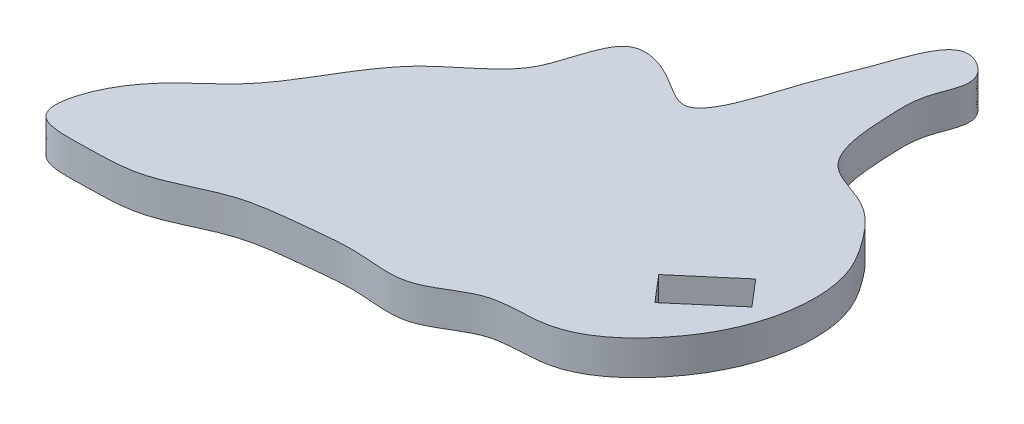
ISO-10303-21;
HEADER;
FILE_DESCRIPTION(('STEP AP214'),'2;1');
FILE_NAME('part.step','',(''),(''),'','','');
FILE_SCHEMA(('AUTOMOTIVE_DESIGN { 1 0 10303 214 1 1 1 1 }'));
ENDSEC;
DATA;
#1=APPLICATION_CONTEXT('core data for automotive mechanical design processes');
#2=APPLICATION_PROTOCOL_DEFINITION('international standard','automotive_design',2000,#1);
#3=PRODUCT_CONTEXT('',#1,'mechanical');
#4=PRODUCT('Part','Part','',(#3));
#5=PRODUCT_RELATED_PRODUCT_CATEGORY('part','',(#4));
#6=PRODUCT_DEFINITION_FORMATION('','',#4);
#7=PRODUCT_DEFINITION_CONTEXT('part definition',#1,'design');
#8=PRODUCT_DEFINITION('design','',#6,#7);
#9=PRODUCT_DEFINITION_SHAPE('','',#8);
#10=(LENGTH_UNIT() NAMED_UNIT(*) SI_UNIT(.MILLI.,.METRE.));
#11=(NAMED_UNIT(*) PLANE_ANGLE_UNIT() SI_UNIT($,.RADIAN.));
#12=(NAMED_UNIT(*) SI_UNIT($,.STERADIAN.) SOLID_ANGLE_UNIT());
#13=UNCERTAINTY_MEASURE_WITH_UNIT(LENGTH_MEASURE(1.E-05),#10,'distance_accuracy_value','');
#14=(GEOMETRIC_REPRESENTATION_CONTEXT(3) GLOBAL_UNCERTAINTY_ASSIGNED_CONTEXT((#13)) GLOBAL_UNIT_ASSIGNED_CONTEXT((#10,
#11,#12)) REPRESENTATION_CONTEXT('',''));
#15=CARTESIAN_POINT('',(0.,0.,0.));
#16=DIRECTION('',(0.,0.,1.));
#17=DIRECTION('',(1.,0.,0.));
#18=AXIS2_PLACEMENT_3D('',#15,#16,#17);
#19=CARTESIAN_POINT('',(-21.4937118023424,5.82080786281612,-44.9247192420672));
#20=CARTESIAN_POINT('',(-20.7495090960647,5.82080786281612,-44.168608810323));
#21=CARTESIAN_POINT('',(-16.8473186747961,5.82080786281612,-44.3347459639853));
#22=CARTESIAN_POINT('',(-11.8877695629677,5.82080786281612,-44.2796755985448));
#23=CARTESIAN_POINT('',(-6.73552611743819,5.82080786281612,-47.5194319644652));
#24=CARTESIAN_POINT('',(-1.08166711714457,5.82080786281612,-48.0062937412049));
#25=CARTESIAN_POINT('',(3.69682183633538,5.82080786281612,-48.6353801714074));
#26=CARTESIAN_POINT('',(8.03740572939902,5.82080786281612,-47.8302652315453));
#27=CARTESIAN_POINT('',(10.9102080211148,5.82080786281612,-49.6162706264283));
#28=CARTESIAN_POINT('',(14.0102946266063,5.82080786281612,-51.4056901517117));
#29=CARTESIAN_POINT('',(19.4607402958262,5.82080786281612,-50.6818274844615));
#30=CARTESIAN_POINT('',(25.239757422972,5.82080786281612,-55.6202912686378));
#31=CARTESIAN_POINT('',(28.7177265277098,5.82080786281612,-62.3854347124005));
#32=CARTESIAN_POINT('',(28.6855888615284,5.82080786281612,-68.7692864827177));
#33=CARTESIAN_POINT('',(26.0314895516941,5.82080786281612,-72.9007599130816));
#34=CARTESIAN_POINT('',(23.4672141211842,5.82080786281612,-75.950078814087));
#35=CARTESIAN_POINT('',(17.6909365791729,5.82080786281612,-76.910599245278));
#36=CARTESIAN_POINT('',(17.4191943347076,5.82080786281612,-82.8836539871628));
#37=CARTESIAN_POINT('',(17.2020761180095,5.82080786281612,-87.2899149088572));
#38=CARTESIAN_POINT('',(19.2987725720755,5.82080786281612,-90.7643500861387));
#39=CARTESIAN_POINT('',(14.7511286503397,5.82080786281612,-93.877589303009));
#40=CARTESIAN_POINT('',(12.910341947581,5.82080786281612,-87.4104051470554));
#41=CARTESIAN_POINT('',(11.023892081615,5.82080786281612,-83.2145764727841));
#42=CARTESIAN_POINT('',(9.92268046217581,5.82080786281612,-79.2079019920944));
#43=CARTESIAN_POINT('',(7.68263356041876,5.82080786281612,-73.9222487003343));
#44=CARTESIAN_POINT('',(3.89404426899399,5.82080786281612,-77.1723871116823));
#45=CARTESIAN_POINT('',(-0.0669296507334657,5.82080786281612,-78.3029078935221));
#46=CARTESIAN_POINT('',(-1.85527923396155,5.82080786281612,-74.7560052124011));
#47=CARTESIAN_POINT('',(-2.68601005073968,5.82080786281612,-70.1252909943946));
#48=CARTESIAN_POINT('',(-10.0665366682588,5.82080786281612,-65.9134066768759));
#49=CARTESIAN_POINT('',(-13.5129033439392,5.82080786281612,-56.5249809585678));
#50=CARTESIAN_POINT('',(-20.5284613360239,5.82080786281612,-52.4258957065665));
#51=CARTESIAN_POINT('',(-22.4764461266043,5.82080786281612,-45.923177952227));
#52=CARTESIAN_POINT('',(-21.4937118023424,5.82080786281612,-44.9247192420672));
#53=B_SPLINE_CURVE_WITH_KNOTS('',3,(#19,#20,#21,#22,#23,#24,#25,#26,#27,#28,#29,#30,#31,#32,#33,
#34,#35,#36,#37,#38,#39,#40,#41,#42,#43,#44,#45,#46,#47,#48,#49,#50,#51,#52),.UNSPECIFIED.,.T.,
.F.,(4,1,1,1,1,1,1,1,1,1,1,1,1,1,1,1,1,1,1,1,1,1,1,1,1,1,1,1,1,1,1,4),(0.,0.0254793810099373,
0.0575432347403678,0.0999556410108082,0.133033817499534,0.163895947509391,0.191559965738004,
0.211929864912126,0.225609616864651,0.258491648264956,0.308276256693139,0.356004359408552,
0.401628858424618,0.418999157725091,0.448323204095496,0.474482631901361,0.516873243511436,
0.538667761491323,0.562806148960943,0.57789910025886,0.616936064484637,0.645339628038696,
0.673283981331484,0.701186966202932,0.724121111102356,0.750378425709185,0.764142361545219,
0.791670233217286,0.838296487185414,0.910523172111104,0.9663539757808,1.),.UNSPECIFIED.);
#54=DIRECTION('',(0.,-1.,0.));
#55=VECTOR('',#54,1.);
#56=SURFACE_OF_LINEAR_EXTRUSION('',#53,#55);
#57=CARTESIAN_POINT('',(-21.4937118023424,5.82080786281612,-44.9247192420672));
#58=VERTEX_POINT('',#57);
#59=EDGE_CURVE('E13',#58,#58,#53,.T.);
#60=ORIENTED_EDGE('',*,*,#59,.F.);
#61=EDGE_LOOP('',(#60));
#62=FACE_BOUND('',#61,.T.);
#63=CARTESIAN_POINT('',(-21.4937118023424,2.64580786281612,-44.9247192420672));
#64=CARTESIAN_POINT('',(-20.7495090960647,2.64580786281612,-44.168608810323));
#65=CARTESIAN_POINT('',(-16.8473186747961,2.64580786281612,-44.3347459639853));
#66=CARTESIAN_POINT('',(-11.8877695629677,2.64580786281612,-44.2796755985448));
#67=CARTESIAN_POINT('',(-6.73552611743819,2.64580786281612,-47.5194319644652));
#68=CARTESIAN_POINT('',(-1.08166711714457,2.64580786281612,-48.0062937412049));
#69=CARTESIAN_POINT('',(3.69682183633538,2.64580786281612,-48.6353801714074));
#70=CARTESIAN_POINT('',(8.03740572939902,2.64580786281612,-47.8302652315453));
#71=CARTESIAN_POINT('',(10.9102080211148,2.64580786281612,-49.6162706264283));
#72=CARTESIAN_POINT('',(14.0102946266063,2.64580786281612,-51.4056901517117));
#73=CARTESIAN_POINT('',(19.4607402958262,2.64580786281612,-50.6818274844615));
#74=CARTESIAN_POINT('',(25.239757422972,2.64580786281612,-55.6202912686378));
#75=CARTESIAN_POINT('',(28.7177265277098,2.64580786281612,-62.3854347124005));
#76=CARTESIAN_POINT('',(28.6855888615284,2.64580786281612,-68.7692864827177));
#77=CARTESIAN_POINT('',(26.0314895516941,2.64580786281612,-72.9007599130816));
#78=CARTESIAN_POINT('',(23.4672141211842,2.64580786281612,-75.950078814087));
#79=CARTESIAN_POINT('',(17.6909365791729,2.64580786281612,-76.910599245278));
#80=CARTESIAN_POINT('',(17.4191943347076,2.64580786281612,-82.8836539871628));
#81=CARTESIAN_POINT('',(17.2020761180095,2.64580786281612,-87.2899149088572));
#82=CARTESIAN_POINT('',(19.2987725720755,2.64580786281612,-90.7643500861387));
#83=CARTESIAN_POINT('',(14.7511286503397,2.64580786281612,-93.877589303009));
#84=CARTESIAN_POINT('',(12.910341947581,2.64580786281612,-87.4104051470554));
#85=CARTESIAN_POINT('',(11.023892081615,2.64580786281612,-83.2145764727841));
#86=CARTESIAN_POINT('',(9.92268046217581,2.64580786281612,-79.2079019920944));
#87=CARTESIAN_POINT('',(7.68263356041876,2.64580786281612,-73.9222487003343));
#88=CARTESIAN_POINT('',(3.89404426899399,2.64580786281612,-77.1723871116823));
#89=CARTESIAN_POINT('',(-0.0669296507334657,2.64580786281612,-78.3029078935221));
#90=CARTESIAN_POINT('',(-1.85527923396155,2.64580786281612,-74.7560052124011));
#91=CARTESIAN_POINT('',(-2.68601005073968,2.64580786281612,-70.1252909943946));
#92=CARTESIAN_POINT('',(-10.0665366682588,2.64580786281612,-65.9134066768759));
#93=CARTESIAN_POINT('',(-13.5129033439392,2.64580786281612,-56.5249809585678));
#94=CARTESIAN_POINT('',(-20.5284613360239,2.64580786281612,-52.4258957065665));
#95=CARTESIAN_POINT('',(-22.4764461266043,2.64580786281612,-45.923177952227));
#96=CARTESIAN_POINT('',(-21.4937118023424,2.64580786281612,-44.9247192420672));
#97=B_SPLINE_CURVE_WITH_KNOTS('',3,(#63,#64,#65,#66,#67,#68,#69,#70,#71,#72,#73,#74,#75,#76,#77,
#78,#79,#80,#81,#82,#83,#84,#85,#86,#87,#88,#89,#90,#91,#92,#93,#94,#95,#96),.UNSPECIFIED.,.T.,
.F.,(4,1,1,1,1,1,1,1,1,1,1,1,1,1,1,1,1,1,1,1,1,1,1,1,1,1,1,1,1,1,1,4),(0.,0.0254793810099373,
0.0575432347403678,0.0999556410108082,0.133033817499534,0.163895947509391,0.191559965738004,
0.211929864912126,0.225609616864651,0.258491648264956,0.308276256693139,0.356004359408552,
0.401628858424618,0.418999157725091,0.448323204095496,0.474482631901361,0.516873243511436,
0.538667761491323,0.562806148960943,0.57789910025886,0.616936064484637,0.645339628038696,
0.673283981331484,0.701186966202932,0.724121111102356,0.750378425709185,0.764142361545219,
0.791670233217286,0.838296487185414,0.910523172111104,0.9663539757808,1.),.UNSPECIFIED.);
#98=CARTESIAN_POINT('',(-21.4937118023424,2.64580786281612,-44.9247192420672));
#99=VERTEX_POINT('',#98);
#100=EDGE_CURVE('E49',#99,#99,#97,.T.);
#101=ORIENTED_EDGE('',*,*,#100,.T.);
#102=EDGE_LOOP('',(#101));
#103=FACE_BOUND('',#102,.T.);
#104=ADVANCED_FACE('F46',(#62,#103),#56,.F.);
#105=CARTESIAN_POINT('',(17.605450660818,5.82080786281612,-80.8926513838277));
#106=DIRECTION('',(0.,1.,0.));
#107=DIRECTION('',(0.,0.,1.));
#108=AXIS2_PLACEMENT_3D('',#105,#106,#107);
#109=PLANE('',#108);
#110=DIRECTION('',(0.760405965600044,0.,-0.649448048330169));
#111=VECTOR('',#110,1.);
#112=CARTESIAN_POINT('',(30.495863149668,5.82080786281612,-65.7999175142455));
#113=LINE('',#112,#111);
#114=CARTESIAN_POINT('',(21.4954162228298,5.82080786281612,-58.1128096334944));
#115=VERTEX_POINT('',#114);
#116=CARTESIAN_POINT('',(26.3239941043901,5.82080786281612,-62.2368047403909));
#117=VERTEX_POINT('',#116);
#118=EDGE_CURVE('E102',#115,#117,#113,.T.);
#119=ORIENTED_EDGE('',*,*,#118,.F.);
#120=DIRECTION('',(-0.649448048330169,0.,-0.760405965600044));
#121=VECTOR('',#120,1.);
#122=CARTESIAN_POINT('',(21.4954162228298,5.82080786281612,-58.1128096334944));
#123=LINE('',#122,#121);
#124=CARTESIAN_POINT('',(19.4334186693815,5.82080786281612,-60.5270985742745));
#125=VERTEX_POINT('',#124);
#126=EDGE_CURVE('E87',#115,#125,#123,.T.);
#127=ORIENTED_EDGE('',*,*,#126,.T.);
#128=DIRECTION('',(0.760405965600044,0.,-0.649448048330169));
#129=VECTOR('',#128,1.);
#130=CARTESIAN_POINT('',(28.4338655962197,5.82080786281612,-68.2142064550257));
#131=LINE('',#130,#129);
#132=CARTESIAN_POINT('',(24.2619965509418,5.82080786281612,-64.6510936811711));
#133=VERTEX_POINT('',#132);
#134=EDGE_CURVE('E97',#125,#133,#131,.T.);
#135=ORIENTED_EDGE('',*,*,#134,.T.);
#136=DIRECTION('',(-0.649448048330169,0.,-0.760405965600044));
#137=VECTOR('',#136,1.);
#138=CARTESIAN_POINT('',(26.3239941043901,5.82080786281612,-62.2368047403909));
#139=LINE('',#138,#137);
#140=EDGE_CURVE('E110',#117,#133,#139,.T.);
#141=ORIENTED_EDGE('',*,*,#140,.F.);
#142=EDGE_LOOP('',(#119,#127,#135,#141));
#143=FACE_BOUND('',#142,.T.);
#144=ORIENTED_EDGE('',*,*,#59,.T.);
#145=EDGE_LOOP('',(#144));
#146=FACE_BOUND('',#145,.T.);
#147=ADVANCED_FACE('F108',(#143,#146),#109,.T.);
#148=CARTESIAN_POINT('',(17.605450660818,2.64580786281612,-80.8926513838277));
#149=DIRECTION('',(0.,1.,0.));
#150=DIRECTION('',(0.,0.,1.));
#151=AXIS2_PLACEMENT_3D('',#148,#149,#150);
#152=PLANE('',#151);
#153=DIRECTION('',(-0.649448048330169,0.,-0.760405965600044));
#154=VECTOR('',#153,1.);
#155=CARTESIAN_POINT('',(21.4954162228298,2.64580786281612,-58.1128096334944));
#156=LINE('',#155,#154);
#157=CARTESIAN_POINT('',(21.4954162228298,2.64580786281612,-58.1128096334944));
#158=VERTEX_POINT('',#157);
#159=CARTESIAN_POINT('',(19.4334186693815,2.64580786281612,-60.5270985742745));
#160=VERTEX_POINT('',#159);
#161=EDGE_CURVE('E70',#158,#160,#156,.T.);
#162=ORIENTED_EDGE('',*,*,#161,.F.);
#163=DIRECTION('',(0.760405965600044,0.,-0.649448048330169));
#164=VECTOR('',#163,1.);
#165=CARTESIAN_POINT('',(23.90970516361,2.64580786281612,-60.1748071869427));
#166=LINE('',#165,#164);
#167=CARTESIAN_POINT('',(26.3239941043901,2.64580786281612,-62.2368047403909));
#168=VERTEX_POINT('',#167);
#169=EDGE_CURVE('E105',#158,#168,#166,.T.);
#170=ORIENTED_EDGE('',*,*,#169,.T.);
#171=DIRECTION('',(-0.649448048330169,0.,-0.760405965600044));
#172=VECTOR('',#171,1.);
#173=CARTESIAN_POINT('',(26.3239941043901,2.64580786281612,-62.2368047403909));
#174=LINE('',#173,#172);
#175=CARTESIAN_POINT('',(24.2619965509418,2.64580786281612,-64.6510936811711));
#176=VERTEX_POINT('',#175);
#177=EDGE_CURVE('E132',#168,#176,#174,.T.);
#178=ORIENTED_EDGE('',*,*,#177,.T.);
#179=DIRECTION('',(0.760405965600044,0.,-0.649448048330169));
#180=VECTOR('',#179,1.);
#181=CARTESIAN_POINT('',(21.8477076101617,2.64580786281612,-62.5890961277228));
#182=LINE('',#181,#180);
#183=EDGE_CURVE('E140',#160,#176,#182,.T.);
#184=ORIENTED_EDGE('',*,*,#183,.F.);
#185=EDGE_LOOP('',(#162,#170,#178,#184));
#186=FACE_BOUND('',#185,.T.);
#187=ORIENTED_EDGE('',*,*,#100,.F.);
#188=EDGE_LOOP('',(#187));
#189=FACE_BOUND('',#188,.T.);
#190=ADVANCED_FACE('F145',(#186,#189),#152,.F.);
#191=CARTESIAN_POINT('',(21.4954162228298,15.3458078628161,-58.1128096334944));
#192=DIRECTION('',(0.760405965600044,0.,-0.649448048330169));
#193=DIRECTION('',(0.649448048330169,0.,0.760405965600044));
#194=AXIS2_PLACEMENT_3D('',#191,#192,#193);
#195=PLANE('',#194);
#196=DIRECTION('',(0.,-1.,0.));
#197=VECTOR('',#196,1.);
#198=CARTESIAN_POINT('',(19.4334186693815,15.3458078628161,-60.5270985742745));
#199=LINE('',#198,#197);
#200=EDGE_CURVE('E92',#125,#160,#199,.T.);
#201=ORIENTED_EDGE('',*,*,#200,.F.);
#202=ORIENTED_EDGE('',*,*,#126,.F.);
#203=DIRECTION('',(0.,-1.,0.));
#204=VECTOR('',#203,1.);
#205=CARTESIAN_POINT('',(21.4954162228298,15.3458078628161,-58.1128096334944));
#206=LINE('',#205,#204);
#207=EDGE_CURVE('E90',#115,#158,#206,.T.);
#208=ORIENTED_EDGE('',*,*,#207,.T.);
#209=ORIENTED_EDGE('',*,*,#161,.T.);
#210=EDGE_LOOP('',(#201,#202,#208,#209));
#211=FACE_BOUND('',#210,.T.);
#212=ADVANCED_FACE('F89',(#211),#195,.T.);
#213=CARTESIAN_POINT('',(26.3239941043901,15.3458078628161,-62.2368047403909));
#214=DIRECTION('',(0.760405965600044,0.,-0.649448048330169));
#215=DIRECTION('',(0.649448048330169,0.,0.760405965600044));
#216=AXIS2_PLACEMENT_3D('',#213,#214,#215);
#217=PLANE('',#216);
#218=DIRECTION('',(0.,-1.,0.));
#219=VECTOR('',#218,1.);
#220=CARTESIAN_POINT('',(24.2619965509418,15.3458078628161,-64.6510936811711));
#221=LINE('',#220,#219);
#222=EDGE_CURVE('E62',#133,#176,#221,.T.);
#223=ORIENTED_EDGE('',*,*,#222,.T.);
#224=ORIENTED_EDGE('',*,*,#177,.F.);
#225=DIRECTION('',(0.,-1.,0.));
#226=VECTOR('',#225,1.);
#227=CARTESIAN_POINT('',(26.3239941043901,15.3458078628161,-62.2368047403909));
#228=LINE('',#227,#226);
#229=EDGE_CURVE('E138',#117,#168,#228,.T.);
#230=ORIENTED_EDGE('',*,*,#229,.F.);
#231=ORIENTED_EDGE('',*,*,#140,.T.);
#232=EDGE_LOOP('',(#223,#224,#230,#231));
#233=FACE_BOUND('',#232,.T.);
#234=ADVANCED_FACE('F150',(#233),#217,.F.);
#235=CARTESIAN_POINT('',(23.90970516361,15.3458078628161,-60.1748071869426));
#236=DIRECTION('',(0.649448048330169,0.,0.760405965600044));
#237=DIRECTION('',(0.,-1.,0.));
#238=AXIS2_PLACEMENT_3D('',#235,#236,#237);
#239=PLANE('',#238);
#240=ORIENTED_EDGE('',*,*,#118,.T.);
#241=ORIENTED_EDGE('',*,*,#229,.T.);
#242=ORIENTED_EDGE('',*,*,#169,.F.);
#243=ORIENTED_EDGE('',*,*,#207,.F.);
#244=EDGE_LOOP('',(#240,#241,#242,#243));
#245=FACE_BOUND('',#244,.T.);
#246=ADVANCED_FACE('F100',(#245),#239,.F.);
#247=CARTESIAN_POINT('',(21.8477076101617,15.3458078628161,-62.5890961277228));
#248=DIRECTION('',(0.649448048330169,0.,0.760405965600044));
#249=DIRECTION('',(0.,-1.,0.));
#250=AXIS2_PLACEMENT_3D('',#247,#248,#249);
#251=PLANE('',#250);
#252=ORIENTED_EDGE('',*,*,#200,.T.);
#253=ORIENTED_EDGE('',*,*,#183,.T.);
#254=ORIENTED_EDGE('',*,*,#222,.F.);
#255=ORIENTED_EDGE('',*,*,#134,.F.);
#256=EDGE_LOOP('',(#252,#253,#254,#255));
#257=FACE_BOUND('',#256,.T.);
#258=ADVANCED_FACE('F148',(#257),#251,.T.);
#259=CLOSED_SHELL('',(#104,#147,#190,#212,#234,#246,#258));
#260=MANIFOLD_SOLID_BREP('B2',#259);
#261=ADVANCED_BREP_SHAPE_REPRESENTATION('',(#18,#260),#14);
#262=SHAPE_DEFINITION_REPRESENTATION(#9,#261);
ENDSEC;
END-ISO-10303-21;
